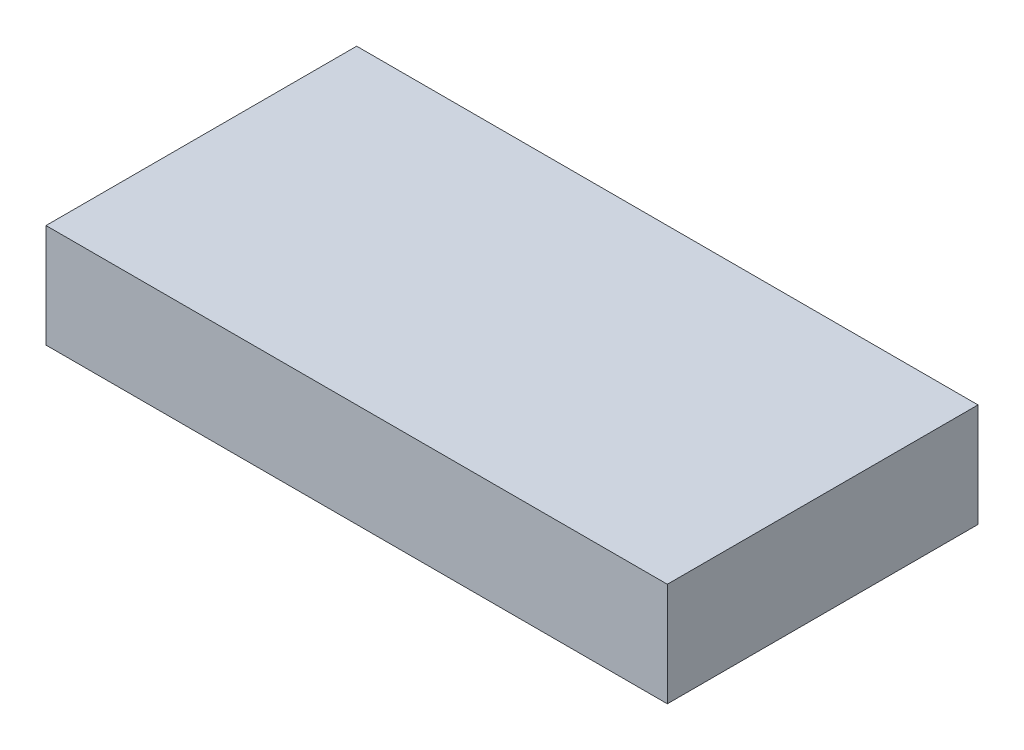
ISO-10303-21;
HEADER;
FILE_DESCRIPTION(('STEP AP214'),'2;1');
FILE_NAME('part.step','',(''),(''),'','','');
FILE_SCHEMA(('AUTOMOTIVE_DESIGN { 1 0 10303 214 1 1 1 1 }'));
ENDSEC;
DATA;
#1=APPLICATION_CONTEXT('core data for automotive mechanical design processes');
#2=APPLICATION_PROTOCOL_DEFINITION('international standard','automotive_design',2000,#1);
#3=PRODUCT_CONTEXT('',#1,'mechanical');
#4=PRODUCT('Part','Part','',(#3));
#5=PRODUCT_RELATED_PRODUCT_CATEGORY('part','',(#4));
#6=PRODUCT_DEFINITION_FORMATION('','',#4);
#7=PRODUCT_DEFINITION_CONTEXT('part definition',#1,'design');
#8=PRODUCT_DEFINITION('design','',#6,#7);
#9=PRODUCT_DEFINITION_SHAPE('','',#8);
#10=(LENGTH_UNIT() NAMED_UNIT(*) SI_UNIT(.MILLI.,.METRE.));
#11=(NAMED_UNIT(*) PLANE_ANGLE_UNIT() SI_UNIT($,.RADIAN.));
#12=(NAMED_UNIT(*) SI_UNIT($,.STERADIAN.) SOLID_ANGLE_UNIT());
#13=UNCERTAINTY_MEASURE_WITH_UNIT(LENGTH_MEASURE(1.E-05),#10,'distance_accuracy_value','');
#14=(GEOMETRIC_REPRESENTATION_CONTEXT(3) GLOBAL_UNCERTAINTY_ASSIGNED_CONTEXT((#13)) GLOBAL_UNIT_ASSIGNED_CONTEXT((#10,
#11,#12)) REPRESENTATION_CONTEXT('',''));
#15=CARTESIAN_POINT('',(0.,0.,0.));
#16=DIRECTION('',(0.,0.,1.));
#17=DIRECTION('',(1.,0.,0.));
#18=AXIS2_PLACEMENT_3D('',#15,#16,#17);
#19=CARTESIAN_POINT('',(-10.6816901408451,4.,-4.96901408450704));
#20=DIRECTION('',(1.,0.,0.));
#21=DIRECTION('',(0.,0.,-1.));
#22=AXIS2_PLACEMENT_3D('',#19,#20,#21);
#23=PLANE('',#22);
#24=DIRECTION('',(0.,0.,1.));
#25=VECTOR('',#24,1.);
#26=CARTESIAN_POINT('',(-10.6816901408451,0.,-4.96901408450704));
#27=LINE('',#26,#25);
#28=CARTESIAN_POINT('',(-10.6816901408451,0.,-4.96901408450704));
#29=VERTEX_POINT('',#28);
#30=CARTESIAN_POINT('',(-10.6816901408451,0.,7.03098591549296));
#31=VERTEX_POINT('',#30);
#32=EDGE_CURVE('E107',#29,#31,#27,.T.);
#33=ORIENTED_EDGE('',*,*,#32,.T.);
#34=DIRECTION('',(0.,-1.,0.));
#35=VECTOR('',#34,1.);
#36=CARTESIAN_POINT('',(-10.6816901408451,4.,7.03098591549296));
#37=LINE('',#36,#35);
#38=CARTESIAN_POINT('',(-10.6816901408451,4.,7.03098591549296));
#39=VERTEX_POINT('',#38);
#40=EDGE_CURVE('E11',#39,#31,#37,.T.);
#41=ORIENTED_EDGE('',*,*,#40,.F.);
#42=DIRECTION('',(0.,0.,1.));
#43=VECTOR('',#42,1.);
#44=CARTESIAN_POINT('',(-10.6816901408451,4.,-4.96901408450704));
#45=LINE('',#44,#43);
#46=CARTESIAN_POINT('',(-10.6816901408451,4.,-4.96901408450704));
#47=VERTEX_POINT('',#46);
#48=EDGE_CURVE('E91',#47,#39,#45,.T.);
#49=ORIENTED_EDGE('',*,*,#48,.F.);
#50=DIRECTION('',(0.,-1.,0.));
#51=VECTOR('',#50,1.);
#52=CARTESIAN_POINT('',(-10.6816901408451,4.,-4.96901408450704));
#53=LINE('',#52,#51);
#54=EDGE_CURVE('E103',#47,#29,#53,.T.);
#55=ORIENTED_EDGE('',*,*,#54,.T.);
#56=EDGE_LOOP('',(#33,#41,#49,#55));
#57=FACE_BOUND('',#56,.T.);
#58=ADVANCED_FACE('F39',(#57),#23,.F.);
#59=CARTESIAN_POINT('',(-10.6816901408451,4.,7.03098591549296));
#60=DIRECTION('',(0.,0.,-1.));
#61=DIRECTION('',(-1.,0.,0.));
#62=AXIS2_PLACEMENT_3D('',#59,#60,#61);
#63=PLANE('',#62);
#64=DIRECTION('',(1.,0.,0.));
#65=VECTOR('',#64,1.);
#66=CARTESIAN_POINT('',(-10.6816901408451,0.,7.03098591549296));
#67=LINE('',#66,#65);
#68=CARTESIAN_POINT('',(13.3183098591549,0.,7.03098591549296));
#69=VERTEX_POINT('',#68);
#70=EDGE_CURVE('E96',#31,#69,#67,.T.);
#71=ORIENTED_EDGE('',*,*,#70,.T.);
#72=DIRECTION('',(0.,-1.,0.));
#73=VECTOR('',#72,1.);
#74=CARTESIAN_POINT('',(13.3183098591549,4.,7.03098591549296));
#75=LINE('',#74,#73);
#76=CARTESIAN_POINT('',(13.3183098591549,4.,7.03098591549296));
#77=VERTEX_POINT('',#76);
#78=EDGE_CURVE('E48',#77,#69,#75,.T.);
#79=ORIENTED_EDGE('',*,*,#78,.F.);
#80=DIRECTION('',(1.,0.,0.));
#81=VECTOR('',#80,1.);
#82=CARTESIAN_POINT('',(-10.6816901408451,4.,7.03098591549296));
#83=LINE('',#82,#81);
#84=EDGE_CURVE('E86',#39,#77,#83,.T.);
#85=ORIENTED_EDGE('',*,*,#84,.F.);
#86=ORIENTED_EDGE('',*,*,#40,.T.);
#87=EDGE_LOOP('',(#71,#79,#85,#86));
#88=FACE_BOUND('',#87,.T.);
#89=ADVANCED_FACE('F95',(#88),#63,.F.);
#90=CARTESIAN_POINT('',(13.3183098591549,4.,-4.96901408450704));
#91=DIRECTION('',(-1.,0.,0.));
#92=DIRECTION('',(0.,0.,1.));
#93=AXIS2_PLACEMENT_3D('',#90,#91,#92);
#94=PLANE('',#93);
#95=DIRECTION('',(0.,0.,-1.));
#96=VECTOR('',#95,1.);
#97=CARTESIAN_POINT('',(13.3183098591549,0.,-4.96901408450704));
#98=LINE('',#97,#96);
#99=CARTESIAN_POINT('',(13.3183098591549,0.,-4.96901408450704));
#100=VERTEX_POINT('',#99);
#101=EDGE_CURVE('E73',#69,#100,#98,.T.);
#102=ORIENTED_EDGE('',*,*,#101,.T.);
#103=DIRECTION('',(0.,-1.,0.));
#104=VECTOR('',#103,1.);
#105=CARTESIAN_POINT('',(13.3183098591549,4.,-4.96901408450704));
#106=LINE('',#105,#104);
#107=CARTESIAN_POINT('',(13.3183098591549,4.,-4.96901408450704));
#108=VERTEX_POINT('',#107);
#109=EDGE_CURVE('E98',#108,#100,#106,.T.);
#110=ORIENTED_EDGE('',*,*,#109,.F.);
#111=DIRECTION('',(0.,0.,-1.));
#112=VECTOR('',#111,1.);
#113=CARTESIAN_POINT('',(13.3183098591549,4.,-4.96901408450704));
#114=LINE('',#113,#112);
#115=EDGE_CURVE('E89',#77,#108,#114,.T.);
#116=ORIENTED_EDGE('',*,*,#115,.F.);
#117=ORIENTED_EDGE('',*,*,#78,.T.);
#118=EDGE_LOOP('',(#102,#110,#116,#117));
#119=FACE_BOUND('',#118,.T.);
#120=ADVANCED_FACE('F99',(#119),#94,.F.);
#121=CARTESIAN_POINT('',(-10.6816901408451,4.,-4.96901408450704));
#122=DIRECTION('',(0.,0.,1.));
#123=DIRECTION('',(1.,0.,0.));
#124=AXIS2_PLACEMENT_3D('',#121,#122,#123);
#125=PLANE('',#124);
#126=DIRECTION('',(-1.,0.,0.));
#127=VECTOR('',#126,1.);
#128=CARTESIAN_POINT('',(-10.6816901408451,0.,-4.96901408450704));
#129=LINE('',#128,#127);
#130=EDGE_CURVE('E79',#100,#29,#129,.T.);
#131=ORIENTED_EDGE('',*,*,#130,.T.);
#132=ORIENTED_EDGE('',*,*,#54,.F.);
#133=DIRECTION('',(-1.,0.,0.));
#134=VECTOR('',#133,1.);
#135=CARTESIAN_POINT('',(-10.6816901408451,4.,-4.96901408450704));
#136=LINE('',#135,#134);
#137=EDGE_CURVE('E56',#108,#47,#136,.T.);
#138=ORIENTED_EDGE('',*,*,#137,.F.);
#139=ORIENTED_EDGE('',*,*,#109,.T.);
#140=EDGE_LOOP('',(#131,#132,#138,#139));
#141=FACE_BOUND('',#140,.T.);
#142=ADVANCED_FACE('F120',(#141),#125,.F.);
#143=CARTESIAN_POINT('',(0.,4.,0.));
#144=DIRECTION('',(0.,1.,0.));
#145=DIRECTION('',(0.,0.,1.));
#146=AXIS2_PLACEMENT_3D('',#143,#144,#145);
#147=PLANE('',#146);
#148=ORIENTED_EDGE('',*,*,#48,.T.);
#149=ORIENTED_EDGE('',*,*,#84,.T.);
#150=ORIENTED_EDGE('',*,*,#115,.T.);
#151=ORIENTED_EDGE('',*,*,#137,.T.);
#152=EDGE_LOOP('',(#148,#149,#150,#151));
#153=FACE_BOUND('',#152,.T.);
#154=ADVANCED_FACE('F87',(#153),#147,.T.);
#155=CARTESIAN_POINT('',(0.,0.,0.));
#156=DIRECTION('',(0.,1.,0.));
#157=DIRECTION('',(0.,0.,1.));
#158=AXIS2_PLACEMENT_3D('',#155,#156,#157);
#159=PLANE('',#158);
#160=ORIENTED_EDGE('',*,*,#32,.F.);
#161=ORIENTED_EDGE('',*,*,#130,.F.);
#162=ORIENTED_EDGE('',*,*,#101,.F.);
#163=ORIENTED_EDGE('',*,*,#70,.F.);
#164=EDGE_LOOP('',(#160,#161,#162,#163));
#165=FACE_BOUND('',#164,.T.);
#166=ADVANCED_FACE('F123',(#165),#159,.F.);
#167=CLOSED_SHELL('',(#58,#89,#120,#142,#154,#166));
#168=MANIFOLD_SOLID_BREP('B2',#167);
#169=ADVANCED_BREP_SHAPE_REPRESENTATION('',(#18,#168),#14);
#170=SHAPE_DEFINITION_REPRESENTATION(#9,#169);
ENDSEC;
END-ISO-10303-21;
